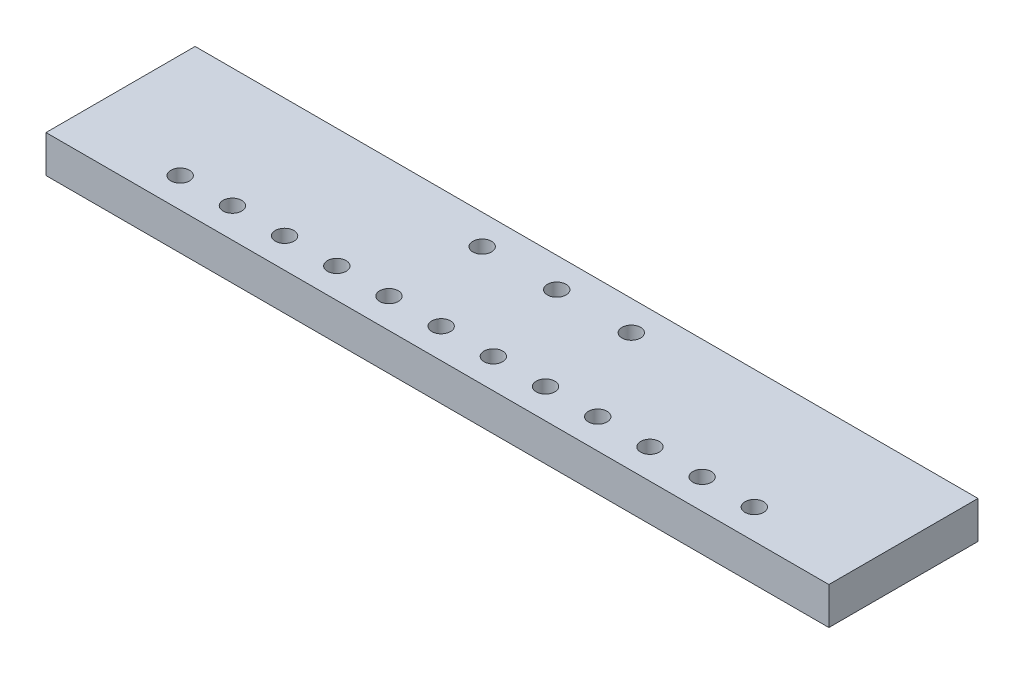
ISO-10303-21;
HEADER;
FILE_DESCRIPTION(('STEP AP214'),'2;1');
FILE_NAME('part.step','',(''),(''),'','','');
FILE_SCHEMA(('AUTOMOTIVE_DESIGN { 1 0 10303 214 1 1 1 1 }'));
ENDSEC;
DATA;
#1=APPLICATION_CONTEXT('core data for automotive mechanical design processes');
#2=APPLICATION_PROTOCOL_DEFINITION('international standard','automotive_design',2000,#1);
#3=PRODUCT_CONTEXT('',#1,'mechanical');
#4=PRODUCT('Part','Part','',(#3));
#5=PRODUCT_RELATED_PRODUCT_CATEGORY('part','',(#4));
#6=PRODUCT_DEFINITION_FORMATION('','',#4);
#7=PRODUCT_DEFINITION_CONTEXT('part definition',#1,'design');
#8=PRODUCT_DEFINITION('design','',#6,#7);
#9=PRODUCT_DEFINITION_SHAPE('','',#8);
#10=(LENGTH_UNIT() NAMED_UNIT(*) SI_UNIT(.MILLI.,.METRE.));
#11=(NAMED_UNIT(*) PLANE_ANGLE_UNIT() SI_UNIT($,.RADIAN.));
#12=(NAMED_UNIT(*) SI_UNIT($,.STERADIAN.) SOLID_ANGLE_UNIT());
#13=UNCERTAINTY_MEASURE_WITH_UNIT(LENGTH_MEASURE(1.E-05),#10,'distance_accuracy_value','');
#14=(GEOMETRIC_REPRESENTATION_CONTEXT(3) GLOBAL_UNCERTAINTY_ASSIGNED_CONTEXT((#13)) GLOBAL_UNIT_ASSIGNED_CONTEXT((#10,
#11,#12)) REPRESENTATION_CONTEXT('',''));
#15=CARTESIAN_POINT('',(0.,0.,0.));
#16=DIRECTION('',(0.,0.,1.));
#17=DIRECTION('',(1.,0.,0.));
#18=AXIS2_PLACEMENT_3D('',#15,#16,#17);
#19=CARTESIAN_POINT('',(66.675,6.35,12.7));
#20=DIRECTION('',(-1.,0.,0.));
#21=DIRECTION('',(0.,0.,1.));
#22=AXIS2_PLACEMENT_3D('',#19,#20,#21);
#23=PLANE('',#22);
#24=DIRECTION('',(0.,0.,-1.));
#25=VECTOR('',#24,1.);
#26=CARTESIAN_POINT('',(66.675,0.,12.7));
#27=LINE('',#26,#25);
#28=CARTESIAN_POINT('',(66.675,0.,12.7));
#29=VERTEX_POINT('',#28);
#30=CARTESIAN_POINT('',(66.675,0.,-12.7));
#31=VERTEX_POINT('',#30);
#32=EDGE_CURVE('E97',#29,#31,#27,.T.);
#33=ORIENTED_EDGE('',*,*,#32,.T.);
#34=DIRECTION('',(0.,-1.,0.));
#35=VECTOR('',#34,1.);
#36=CARTESIAN_POINT('',(66.675,6.35,-12.7));
#37=LINE('',#36,#35);
#38=CARTESIAN_POINT('',(66.675,6.35,-12.7));
#39=VERTEX_POINT('',#38);
#40=EDGE_CURVE('E11',#39,#31,#37,.T.);
#41=ORIENTED_EDGE('',*,*,#40,.F.);
#42=DIRECTION('',(0.,0.,-1.));
#43=VECTOR('',#42,1.);
#44=CARTESIAN_POINT('',(66.675,6.35,12.7));
#45=LINE('',#44,#43);
#46=CARTESIAN_POINT('',(66.675,6.35,12.7));
#47=VERTEX_POINT('',#46);
#48=EDGE_CURVE('E85',#47,#39,#45,.T.);
#49=ORIENTED_EDGE('',*,*,#48,.F.);
#50=DIRECTION('',(0.,-1.,0.));
#51=VECTOR('',#50,1.);
#52=CARTESIAN_POINT('',(66.675,6.35,12.7));
#53=LINE('',#52,#51);
#54=EDGE_CURVE('E93',#47,#29,#53,.T.);
#55=ORIENTED_EDGE('',*,*,#54,.T.);
#56=EDGE_LOOP('',(#33,#41,#49,#55));
#57=FACE_BOUND('',#56,.T.);
#58=ADVANCED_FACE('F34',(#57),#23,.F.);
#59=CARTESIAN_POINT('',(-66.675,6.35,-12.7));
#60=DIRECTION('',(0.,0.,1.));
#61=DIRECTION('',(1.,0.,0.));
#62=AXIS2_PLACEMENT_3D('',#59,#60,#61);
#63=PLANE('',#62);
#64=DIRECTION('',(-1.,0.,0.));
#65=VECTOR('',#64,1.);
#66=CARTESIAN_POINT('',(-66.675,0.,-12.7));
#67=LINE('',#66,#65);
#68=CARTESIAN_POINT('',(-66.675,0.,-12.7));
#69=VERTEX_POINT('',#68);
#70=EDGE_CURVE('E89',#31,#69,#67,.T.);
#71=ORIENTED_EDGE('',*,*,#70,.T.);
#72=DIRECTION('',(0.,-1.,0.));
#73=VECTOR('',#72,1.);
#74=CARTESIAN_POINT('',(-66.675,6.35,-12.7));
#75=LINE('',#74,#73);
#76=CARTESIAN_POINT('',(-66.675,6.35,-12.7));
#77=VERTEX_POINT('',#76);
#78=EDGE_CURVE('E42',#77,#69,#75,.T.);
#79=ORIENTED_EDGE('',*,*,#78,.F.);
#80=DIRECTION('',(-1.,0.,0.));
#81=VECTOR('',#80,1.);
#82=CARTESIAN_POINT('',(-66.675,6.35,-12.7));
#83=LINE('',#82,#81);
#84=EDGE_CURVE('E80',#39,#77,#83,.T.);
#85=ORIENTED_EDGE('',*,*,#84,.F.);
#86=ORIENTED_EDGE('',*,*,#40,.T.);
#87=EDGE_LOOP('',(#71,#79,#85,#86));
#88=FACE_BOUND('',#87,.T.);
#89=ADVANCED_FACE('F88',(#88),#63,.F.);
#90=CARTESIAN_POINT('',(-66.675,6.35,12.7));
#91=DIRECTION('',(1.,0.,0.));
#92=DIRECTION('',(0.,0.,-1.));
#93=AXIS2_PLACEMENT_3D('',#90,#91,#92);
#94=PLANE('',#93);
#95=DIRECTION('',(0.,0.,1.));
#96=VECTOR('',#95,1.);
#97=CARTESIAN_POINT('',(-66.675,0.,12.7));
#98=LINE('',#97,#96);
#99=CARTESIAN_POINT('',(-66.675,0.,12.7));
#100=VERTEX_POINT('',#99);
#101=EDGE_CURVE('E67',#69,#100,#98,.T.);
#102=ORIENTED_EDGE('',*,*,#101,.T.);
#103=DIRECTION('',(0.,-1.,0.));
#104=VECTOR('',#103,1.);
#105=CARTESIAN_POINT('',(-66.675,6.35,12.7));
#106=LINE('',#105,#104);
#107=CARTESIAN_POINT('',(-66.675,6.35,12.7));
#108=VERTEX_POINT('',#107);
#109=EDGE_CURVE('E90',#108,#100,#106,.T.);
#110=ORIENTED_EDGE('',*,*,#109,.F.);
#111=DIRECTION('',(0.,0.,1.));
#112=VECTOR('',#111,1.);
#113=CARTESIAN_POINT('',(-66.675,6.35,12.7));
#114=LINE('',#113,#112);
#115=EDGE_CURVE('E83',#77,#108,#114,.T.);
#116=ORIENTED_EDGE('',*,*,#115,.F.);
#117=ORIENTED_EDGE('',*,*,#78,.T.);
#118=EDGE_LOOP('',(#102,#110,#116,#117));
#119=FACE_BOUND('',#118,.T.);
#120=ADVANCED_FACE('F91',(#119),#94,.F.);
#121=CARTESIAN_POINT('',(-66.675,6.35,12.7));
#122=DIRECTION('',(0.,0.,-1.));
#123=DIRECTION('',(-1.,0.,0.));
#124=AXIS2_PLACEMENT_3D('',#121,#122,#123);
#125=PLANE('',#124);
#126=DIRECTION('',(1.,0.,0.));
#127=VECTOR('',#126,1.);
#128=CARTESIAN_POINT('',(-66.675,0.,12.7));
#129=LINE('',#128,#127);
#130=EDGE_CURVE('E73',#100,#29,#129,.T.);
#131=ORIENTED_EDGE('',*,*,#130,.T.);
#132=ORIENTED_EDGE('',*,*,#54,.F.);
#133=DIRECTION('',(1.,0.,0.));
#134=VECTOR('',#133,1.);
#135=CARTESIAN_POINT('',(-66.675,6.35,12.7));
#136=LINE('',#135,#134);
#137=EDGE_CURVE('E50',#108,#47,#136,.T.);
#138=ORIENTED_EDGE('',*,*,#137,.F.);
#139=ORIENTED_EDGE('',*,*,#109,.T.);
#140=EDGE_LOOP('',(#131,#132,#138,#139));
#141=FACE_BOUND('',#140,.T.);
#142=ADVANCED_FACE('F105',(#141),#125,.F.);
#143=CARTESIAN_POINT('',(0.,6.35,0.));
#144=DIRECTION('',(0.,-1.,0.));
#145=DIRECTION('',(0.,0.,-1.));
#146=AXIS2_PLACEMENT_3D('',#143,#144,#145);
#147=PLANE('',#146);
#148=CARTESIAN_POINT('',(48.895,6.35,7.62));
#149=DIRECTION('',(0.,1.,0.));
#150=DIRECTION('',(0.,0.,1.));
#151=AXIS2_PLACEMENT_3D('',#148,#149,#150);
#152=CIRCLE('',#151,1.5875);
#153=CARTESIAN_POINT('',(48.895,6.35,9.2075));
#154=VERTEX_POINT('',#153);
#155=EDGE_CURVE('E163',#154,#154,#152,.T.);
#156=ORIENTED_EDGE('',*,*,#155,.F.);
#157=EDGE_LOOP('',(#156));
#158=FACE_BOUND('',#157,.T.);
#159=CARTESIAN_POINT('',(40.005,6.35,7.62));
#160=DIRECTION('',(0.,1.,0.));
#161=DIRECTION('',(0.,0.,1.));
#162=AXIS2_PLACEMENT_3D('',#159,#160,#161);
#163=CIRCLE('',#162,1.5875);
#164=CARTESIAN_POINT('',(40.005,6.35,9.2075));
#165=VERTEX_POINT('',#164);
#166=EDGE_CURVE('E162',#165,#165,#163,.T.);
#167=ORIENTED_EDGE('',*,*,#166,.F.);
#168=EDGE_LOOP('',(#167));
#169=FACE_BOUND('',#168,.T.);
#170=CARTESIAN_POINT('',(31.115,6.35,7.62));
#171=DIRECTION('',(0.,1.,0.));
#172=DIRECTION('',(0.,0.,1.));
#173=AXIS2_PLACEMENT_3D('',#170,#171,#172);
#174=CIRCLE('',#173,1.5875);
#175=CARTESIAN_POINT('',(31.115,6.35,9.2075));
#176=VERTEX_POINT('',#175);
#177=EDGE_CURVE('E169',#176,#176,#174,.T.);
#178=ORIENTED_EDGE('',*,*,#177,.F.);
#179=EDGE_LOOP('',(#178));
#180=FACE_BOUND('',#179,.T.);
#181=CARTESIAN_POINT('',(22.225,6.35,7.62));
#182=DIRECTION('',(0.,1.,0.));
#183=DIRECTION('',(0.,0.,1.));
#184=AXIS2_PLACEMENT_3D('',#181,#182,#183);
#185=CIRCLE('',#184,1.5875);
#186=CARTESIAN_POINT('',(22.225,6.35,9.2075));
#187=VERTEX_POINT('',#186);
#188=EDGE_CURVE('E175',#187,#187,#185,.T.);
#189=ORIENTED_EDGE('',*,*,#188,.F.);
#190=EDGE_LOOP('',(#189));
#191=FACE_BOUND('',#190,.T.);
#192=CARTESIAN_POINT('',(13.335,6.35,7.62));
#193=DIRECTION('',(0.,1.,0.));
#194=DIRECTION('',(0.,0.,1.));
#195=AXIS2_PLACEMENT_3D('',#192,#193,#194);
#196=CIRCLE('',#195,1.5875);
#197=CARTESIAN_POINT('',(13.335,6.35,9.2075));
#198=VERTEX_POINT('',#197);
#199=EDGE_CURVE('E181',#198,#198,#196,.T.);
#200=ORIENTED_EDGE('',*,*,#199,.F.);
#201=EDGE_LOOP('',(#200));
#202=FACE_BOUND('',#201,.T.);
#203=CARTESIAN_POINT('',(4.445,6.35,7.62));
#204=DIRECTION('',(0.,1.,0.));
#205=DIRECTION('',(0.,0.,1.));
#206=AXIS2_PLACEMENT_3D('',#203,#204,#205);
#207=CIRCLE('',#206,1.5875);
#208=CARTESIAN_POINT('',(4.445,6.35,9.2075));
#209=VERTEX_POINT('',#208);
#210=EDGE_CURVE('E187',#209,#209,#207,.T.);
#211=ORIENTED_EDGE('',*,*,#210,.F.);
#212=EDGE_LOOP('',(#211));
#213=FACE_BOUND('',#212,.T.);
#214=CARTESIAN_POINT('',(-4.445,6.35,7.62));
#215=DIRECTION('',(0.,1.,0.));
#216=DIRECTION('',(0.,0.,1.));
#217=AXIS2_PLACEMENT_3D('',#214,#215,#216);
#218=CIRCLE('',#217,1.5875);
#219=CARTESIAN_POINT('',(-4.445,6.35,9.2075));
#220=VERTEX_POINT('',#219);
#221=EDGE_CURVE('E193',#220,#220,#218,.T.);
#222=ORIENTED_EDGE('',*,*,#221,.F.);
#223=EDGE_LOOP('',(#222));
#224=FACE_BOUND('',#223,.T.);
#225=CARTESIAN_POINT('',(-40.005,6.35,7.62));
#226=DIRECTION('',(0.,1.,0.));
#227=DIRECTION('',(0.,0.,1.));
#228=AXIS2_PLACEMENT_3D('',#225,#226,#227);
#229=CIRCLE('',#228,1.5875);
#230=CARTESIAN_POINT('',(-40.005,6.35,9.2075));
#231=VERTEX_POINT('',#230);
#232=EDGE_CURVE('E127',#231,#231,#229,.T.);
#233=ORIENTED_EDGE('',*,*,#232,.F.);
#234=EDGE_LOOP('',(#233));
#235=FACE_BOUND('',#234,.T.);
#236=CARTESIAN_POINT('',(12.7,6.35,-7.62));
#237=DIRECTION('',(0.,1.,0.));
#238=DIRECTION('',(0.,0.,1.));
#239=AXIS2_PLACEMENT_3D('',#236,#237,#238);
#240=CIRCLE('',#239,1.5875);
#241=CARTESIAN_POINT('',(12.7,6.35,-6.0325));
#242=VERTEX_POINT('',#241);
#243=EDGE_CURVE('E126',#242,#242,#240,.T.);
#244=ORIENTED_EDGE('',*,*,#243,.F.);
#245=EDGE_LOOP('',(#244));
#246=FACE_BOUND('',#245,.T.);
#247=CARTESIAN_POINT('',(-12.7,6.35,-7.62));
#248=DIRECTION('',(0.,1.,0.));
#249=DIRECTION('',(0.,0.,1.));
#250=AXIS2_PLACEMENT_3D('',#247,#248,#249);
#251=CIRCLE('',#250,1.5875);
#252=CARTESIAN_POINT('',(-12.7,6.35,-6.0325));
#253=VERTEX_POINT('',#252);
#254=EDGE_CURVE('E119',#253,#253,#251,.T.);
#255=ORIENTED_EDGE('',*,*,#254,.F.);
#256=EDGE_LOOP('',(#255));
#257=FACE_BOUND('',#256,.T.);
#258=CARTESIAN_POINT('',(-22.225,6.35,7.62));
#259=DIRECTION('',(0.,1.,0.));
#260=DIRECTION('',(0.,0.,1.));
#261=AXIS2_PLACEMENT_3D('',#258,#259,#260);
#262=CIRCLE('',#261,1.5875);
#263=CARTESIAN_POINT('',(-22.225,6.35,9.2075));
#264=VERTEX_POINT('',#263);
#265=EDGE_CURVE('E151',#264,#264,#262,.T.);
#266=ORIENTED_EDGE('',*,*,#265,.F.);
#267=EDGE_LOOP('',(#266));
#268=FACE_BOUND('',#267,.T.);
#269=CARTESIAN_POINT('',(-48.895,6.35,7.62));
#270=DIRECTION('',(0.,1.,0.));
#271=DIRECTION('',(0.,0.,1.));
#272=AXIS2_PLACEMENT_3D('',#269,#270,#271);
#273=CIRCLE('',#272,1.5875);
#274=CARTESIAN_POINT('',(-48.895,6.35,9.2075));
#275=VERTEX_POINT('',#274);
#276=EDGE_CURVE('E150',#275,#275,#273,.T.);
#277=ORIENTED_EDGE('',*,*,#276,.F.);
#278=EDGE_LOOP('',(#277));
#279=FACE_BOUND('',#278,.T.);
#280=CARTESIAN_POINT('',(-13.335,6.35,7.62));
#281=DIRECTION('',(0.,1.,0.));
#282=DIRECTION('',(0.,0.,1.));
#283=AXIS2_PLACEMENT_3D('',#280,#281,#282);
#284=CIRCLE('',#283,1.5875);
#285=CARTESIAN_POINT('',(-13.335,6.35,9.2075));
#286=VERTEX_POINT('',#285);
#287=EDGE_CURVE('E139',#286,#286,#284,.T.);
#288=ORIENTED_EDGE('',*,*,#287,.F.);
#289=EDGE_LOOP('',(#288));
#290=FACE_BOUND('',#289,.T.);
#291=CARTESIAN_POINT('',(-31.115,6.35,7.62));
#292=DIRECTION('',(0.,1.,0.));
#293=DIRECTION('',(0.,0.,1.));
#294=AXIS2_PLACEMENT_3D('',#291,#292,#293);
#295=CIRCLE('',#294,1.5875);
#296=CARTESIAN_POINT('',(-31.115,6.35,9.2075));
#297=VERTEX_POINT('',#296);
#298=EDGE_CURVE('E138',#297,#297,#295,.T.);
#299=ORIENTED_EDGE('',*,*,#298,.F.);
#300=EDGE_LOOP('',(#299));
#301=FACE_BOUND('',#300,.T.);
#302=CARTESIAN_POINT('',(0.,6.35,-7.62));
#303=DIRECTION('',(0.,1.,0.));
#304=DIRECTION('',(0.,0.,1.));
#305=AXIS2_PLACEMENT_3D('',#302,#303,#304);
#306=CIRCLE('',#305,1.5875);
#307=CARTESIAN_POINT('',(0.,6.35,-6.0325));
#308=VERTEX_POINT('',#307);
#309=EDGE_CURVE('E113',#308,#308,#306,.T.);
#310=ORIENTED_EDGE('',*,*,#309,.F.);
#311=EDGE_LOOP('',(#310));
#312=FACE_BOUND('',#311,.T.);
#313=ORIENTED_EDGE('',*,*,#48,.T.);
#314=ORIENTED_EDGE('',*,*,#84,.T.);
#315=ORIENTED_EDGE('',*,*,#115,.T.);
#316=ORIENTED_EDGE('',*,*,#137,.T.);
#317=EDGE_LOOP('',(#313,#314,#315,#316));
#318=FACE_BOUND('',#317,.T.);
#319=ADVANCED_FACE('F81',(#158,#169,#180,#191,#202,#213,#224,#235,#246,#257,#268,#279,#290,#301,
#312,#318),#147,.F.);
#320=CARTESIAN_POINT('',(0.,0.,0.));
#321=DIRECTION('',(0.,-1.,0.));
#322=DIRECTION('',(0.,0.,-1.));
#323=AXIS2_PLACEMENT_3D('',#320,#321,#322);
#324=PLANE('',#323);
#325=CARTESIAN_POINT('',(48.895,0.,7.62));
#326=DIRECTION('',(0.,-1.,0.));
#327=DIRECTION('',(0.,0.,-1.));
#328=AXIS2_PLACEMENT_3D('',#325,#326,#327);
#329=CIRCLE('',#328,1.5875);
#330=CARTESIAN_POINT('',(48.895,0.,6.0325));
#331=VERTEX_POINT('',#330);
#332=EDGE_CURVE('E159',#331,#331,#329,.F.);
#333=ORIENTED_EDGE('',*,*,#332,.T.);
#334=EDGE_LOOP('',(#333));
#335=FACE_BOUND('',#334,.T.);
#336=CARTESIAN_POINT('',(40.005,0.,7.62));
#337=DIRECTION('',(0.,-1.,0.));
#338=DIRECTION('',(0.,0.,-1.));
#339=AXIS2_PLACEMENT_3D('',#336,#337,#338);
#340=CIRCLE('',#339,1.5875);
#341=CARTESIAN_POINT('',(40.005,0.,6.0325));
#342=VERTEX_POINT('',#341);
#343=EDGE_CURVE('E166',#342,#342,#340,.F.);
#344=ORIENTED_EDGE('',*,*,#343,.T.);
#345=EDGE_LOOP('',(#344));
#346=FACE_BOUND('',#345,.T.);
#347=CARTESIAN_POINT('',(31.115,0.,7.62));
#348=DIRECTION('',(0.,-1.,0.));
#349=DIRECTION('',(0.,0.,-1.));
#350=AXIS2_PLACEMENT_3D('',#347,#348,#349);
#351=CIRCLE('',#350,1.5875);
#352=CARTESIAN_POINT('',(31.115,0.,6.0325));
#353=VERTEX_POINT('',#352);
#354=EDGE_CURVE('E172',#353,#353,#351,.F.);
#355=ORIENTED_EDGE('',*,*,#354,.T.);
#356=EDGE_LOOP('',(#355));
#357=FACE_BOUND('',#356,.T.);
#358=CARTESIAN_POINT('',(22.225,0.,7.62));
#359=DIRECTION('',(0.,-1.,0.));
#360=DIRECTION('',(0.,0.,-1.));
#361=AXIS2_PLACEMENT_3D('',#358,#359,#360);
#362=CIRCLE('',#361,1.5875);
#363=CARTESIAN_POINT('',(22.225,0.,6.0325));
#364=VERTEX_POINT('',#363);
#365=EDGE_CURVE('E178',#364,#364,#362,.F.);
#366=ORIENTED_EDGE('',*,*,#365,.T.);
#367=EDGE_LOOP('',(#366));
#368=FACE_BOUND('',#367,.T.);
#369=CARTESIAN_POINT('',(13.335,0.,7.62));
#370=DIRECTION('',(0.,-1.,0.));
#371=DIRECTION('',(0.,0.,-1.));
#372=AXIS2_PLACEMENT_3D('',#369,#370,#371);
#373=CIRCLE('',#372,1.5875);
#374=CARTESIAN_POINT('',(13.335,0.,6.03249999999999));
#375=VERTEX_POINT('',#374);
#376=EDGE_CURVE('E184',#375,#375,#373,.F.);
#377=ORIENTED_EDGE('',*,*,#376,.T.);
#378=EDGE_LOOP('',(#377));
#379=FACE_BOUND('',#378,.T.);
#380=CARTESIAN_POINT('',(4.445,0.,7.62));
#381=DIRECTION('',(0.,-1.,0.));
#382=DIRECTION('',(0.,0.,-1.));
#383=AXIS2_PLACEMENT_3D('',#380,#381,#382);
#384=CIRCLE('',#383,1.5875);
#385=CARTESIAN_POINT('',(4.445,0.,6.0325));
#386=VERTEX_POINT('',#385);
#387=EDGE_CURVE('E190',#386,#386,#384,.F.);
#388=ORIENTED_EDGE('',*,*,#387,.T.);
#389=EDGE_LOOP('',(#388));
#390=FACE_BOUND('',#389,.T.);
#391=CARTESIAN_POINT('',(-4.445,0.,7.62));
#392=DIRECTION('',(0.,-1.,0.));
#393=DIRECTION('',(0.,0.,-1.));
#394=AXIS2_PLACEMENT_3D('',#391,#392,#393);
#395=CIRCLE('',#394,1.5875);
#396=CARTESIAN_POINT('',(-4.445,0.,6.0325));
#397=VERTEX_POINT('',#396);
#398=EDGE_CURVE('E154',#397,#397,#395,.F.);
#399=ORIENTED_EDGE('',*,*,#398,.T.);
#400=EDGE_LOOP('',(#399));
#401=FACE_BOUND('',#400,.T.);
#402=CARTESIAN_POINT('',(-40.005,0.,7.62));
#403=DIRECTION('',(0.,-1.,0.));
#404=DIRECTION('',(0.,0.,-1.));
#405=AXIS2_PLACEMENT_3D('',#402,#403,#404);
#406=CIRCLE('',#405,1.5875);
#407=CARTESIAN_POINT('',(-40.005,0.,6.0325));
#408=VERTEX_POINT('',#407);
#409=EDGE_CURVE('E123',#408,#408,#406,.F.);
#410=ORIENTED_EDGE('',*,*,#409,.T.);
#411=EDGE_LOOP('',(#410));
#412=FACE_BOUND('',#411,.T.);
#413=CARTESIAN_POINT('',(12.7,0.,-7.62));
#414=DIRECTION('',(0.,-1.,0.));
#415=DIRECTION('',(0.,0.,-1.));
#416=AXIS2_PLACEMENT_3D('',#413,#414,#415);
#417=CIRCLE('',#416,1.5875);
#418=CARTESIAN_POINT('',(12.7,0.,-9.2075));
#419=VERTEX_POINT('',#418);
#420=EDGE_CURVE('E122',#419,#419,#417,.F.);
#421=ORIENTED_EDGE('',*,*,#420,.T.);
#422=EDGE_LOOP('',(#421));
#423=FACE_BOUND('',#422,.T.);
#424=CARTESIAN_POINT('',(-12.7,0.,-7.62));
#425=DIRECTION('',(0.,-1.,0.));
#426=DIRECTION('',(0.,0.,-1.));
#427=AXIS2_PLACEMENT_3D('',#424,#425,#426);
#428=CIRCLE('',#427,1.5875);
#429=CARTESIAN_POINT('',(-12.7,0.,-9.2075));
#430=VERTEX_POINT('',#429);
#431=EDGE_CURVE('E116',#430,#430,#428,.F.);
#432=ORIENTED_EDGE('',*,*,#431,.T.);
#433=EDGE_LOOP('',(#432));
#434=FACE_BOUND('',#433,.T.);
#435=CARTESIAN_POINT('',(-22.225,0.,7.62));
#436=DIRECTION('',(0.,-1.,0.));
#437=DIRECTION('',(0.,0.,-1.));
#438=AXIS2_PLACEMENT_3D('',#435,#436,#437);
#439=CIRCLE('',#438,1.5875);
#440=CARTESIAN_POINT('',(-22.225,0.,6.0325));
#441=VERTEX_POINT('',#440);
#442=EDGE_CURVE('E147',#441,#441,#439,.F.);
#443=ORIENTED_EDGE('',*,*,#442,.T.);
#444=EDGE_LOOP('',(#443));
#445=FACE_BOUND('',#444,.T.);
#446=CARTESIAN_POINT('',(-48.895,0.,7.62));
#447=DIRECTION('',(0.,-1.,0.));
#448=DIRECTION('',(0.,0.,-1.));
#449=AXIS2_PLACEMENT_3D('',#446,#447,#448);
#450=CIRCLE('',#449,1.5875);
#451=CARTESIAN_POINT('',(-48.895,0.,6.0325));
#452=VERTEX_POINT('',#451);
#453=EDGE_CURVE('E142',#452,#452,#450,.F.);
#454=ORIENTED_EDGE('',*,*,#453,.T.);
#455=EDGE_LOOP('',(#454));
#456=FACE_BOUND('',#455,.T.);
#457=CARTESIAN_POINT('',(-13.335,0.,7.62));
#458=DIRECTION('',(0.,-1.,0.));
#459=DIRECTION('',(0.,0.,-1.));
#460=AXIS2_PLACEMENT_3D('',#457,#458,#459);
#461=CIRCLE('',#460,1.5875);
#462=CARTESIAN_POINT('',(-13.335,0.,6.0325));
#463=VERTEX_POINT('',#462);
#464=EDGE_CURVE('E135',#463,#463,#461,.F.);
#465=ORIENTED_EDGE('',*,*,#464,.T.);
#466=EDGE_LOOP('',(#465));
#467=FACE_BOUND('',#466,.T.);
#468=CARTESIAN_POINT('',(-31.115,0.,7.62));
#469=DIRECTION('',(0.,-1.,0.));
#470=DIRECTION('',(0.,0.,-1.));
#471=AXIS2_PLACEMENT_3D('',#468,#469,#470);
#472=CIRCLE('',#471,1.5875);
#473=CARTESIAN_POINT('',(-31.115,0.,6.0325));
#474=VERTEX_POINT('',#473);
#475=EDGE_CURVE('E130',#474,#474,#472,.F.);
#476=ORIENTED_EDGE('',*,*,#475,.T.);
#477=EDGE_LOOP('',(#476));
#478=FACE_BOUND('',#477,.T.);
#479=CARTESIAN_POINT('',(0.,0.,-7.62));
#480=DIRECTION('',(0.,-1.,0.));
#481=DIRECTION('',(0.,0.,-1.));
#482=AXIS2_PLACEMENT_3D('',#479,#480,#481);
#483=CIRCLE('',#482,1.5875);
#484=CARTESIAN_POINT('',(0.,0.,-9.2075));
#485=VERTEX_POINT('',#484);
#486=EDGE_CURVE('E100',#485,#485,#483,.F.);
#487=ORIENTED_EDGE('',*,*,#486,.T.);
#488=EDGE_LOOP('',(#487));
#489=FACE_BOUND('',#488,.T.);
#490=ORIENTED_EDGE('',*,*,#32,.F.);
#491=ORIENTED_EDGE('',*,*,#130,.F.);
#492=ORIENTED_EDGE('',*,*,#101,.F.);
#493=ORIENTED_EDGE('',*,*,#70,.F.);
#494=EDGE_LOOP('',(#490,#491,#492,#493));
#495=FACE_BOUND('',#494,.T.);
#496=ADVANCED_FACE('F108',(#335,#346,#357,#368,#379,#390,#401,#412,#423,#434,#445,#456,#467,
#478,#489,#495),#324,.T.);
#497=CARTESIAN_POINT('',(0.,-4.49012806053459,-7.62));
#498=DIRECTION('',(0.,1.,0.));
#499=DIRECTION('',(0.,0.,1.));
#500=AXIS2_PLACEMENT_3D('',#497,#498,#499);
#501=CYLINDRICAL_SURFACE('',#500,1.5875);
#502=ORIENTED_EDGE('',*,*,#309,.T.);
#503=EDGE_LOOP('',(#502));
#504=FACE_BOUND('',#503,.T.);
#505=ORIENTED_EDGE('',*,*,#486,.F.);
#506=EDGE_LOOP('',(#505));
#507=FACE_BOUND('',#506,.T.);
#508=ADVANCED_FACE('F224',(#504,#507),#501,.F.);
#509=CARTESIAN_POINT('',(-31.115,-4.49012806053459,7.62));
#510=DIRECTION('',(0.,1.,0.));
#511=DIRECTION('',(0.,0.,1.));
#512=AXIS2_PLACEMENT_3D('',#509,#510,#511);
#513=CYLINDRICAL_SURFACE('',#512,1.5875);
#514=ORIENTED_EDGE('',*,*,#298,.T.);
#515=EDGE_LOOP('',(#514));
#516=FACE_BOUND('',#515,.T.);
#517=ORIENTED_EDGE('',*,*,#475,.F.);
#518=EDGE_LOOP('',(#517));
#519=FACE_BOUND('',#518,.T.);
#520=ADVANCED_FACE('F227',(#516,#519),#513,.F.);
#521=CARTESIAN_POINT('',(-13.335,-4.49012806053459,7.62));
#522=DIRECTION('',(0.,1.,0.));
#523=DIRECTION('',(0.,0.,1.));
#524=AXIS2_PLACEMENT_3D('',#521,#522,#523);
#525=CYLINDRICAL_SURFACE('',#524,1.5875);
#526=ORIENTED_EDGE('',*,*,#287,.T.);
#527=EDGE_LOOP('',(#526));
#528=FACE_BOUND('',#527,.T.);
#529=ORIENTED_EDGE('',*,*,#464,.F.);
#530=EDGE_LOOP('',(#529));
#531=FACE_BOUND('',#530,.T.);
#532=ADVANCED_FACE('F271',(#528,#531),#525,.F.);
#533=CARTESIAN_POINT('',(-48.895,-4.49012806053459,7.62));
#534=DIRECTION('',(0.,1.,0.));
#535=DIRECTION('',(0.,0.,1.));
#536=AXIS2_PLACEMENT_3D('',#533,#534,#535);
#537=CYLINDRICAL_SURFACE('',#536,1.5875);
#538=ORIENTED_EDGE('',*,*,#276,.T.);
#539=EDGE_LOOP('',(#538));
#540=FACE_BOUND('',#539,.T.);
#541=ORIENTED_EDGE('',*,*,#453,.F.);
#542=EDGE_LOOP('',(#541));
#543=FACE_BOUND('',#542,.T.);
#544=ADVANCED_FACE('F279',(#540,#543),#537,.F.);
#545=CARTESIAN_POINT('',(-22.225,-4.49012806053459,7.62));
#546=DIRECTION('',(0.,1.,0.));
#547=DIRECTION('',(0.,0.,1.));
#548=AXIS2_PLACEMENT_3D('',#545,#546,#547);
#549=CYLINDRICAL_SURFACE('',#548,1.5875);
#550=ORIENTED_EDGE('',*,*,#265,.T.);
#551=EDGE_LOOP('',(#550));
#552=FACE_BOUND('',#551,.T.);
#553=ORIENTED_EDGE('',*,*,#442,.F.);
#554=EDGE_LOOP('',(#553));
#555=FACE_BOUND('',#554,.T.);
#556=ADVANCED_FACE('F287',(#552,#555),#549,.F.);
#557=CARTESIAN_POINT('',(-12.7,-4.49012806053459,-7.62));
#558=DIRECTION('',(0.,1.,0.));
#559=DIRECTION('',(0.,0.,1.));
#560=AXIS2_PLACEMENT_3D('',#557,#558,#559);
#561=CYLINDRICAL_SURFACE('',#560,1.5875);
#562=ORIENTED_EDGE('',*,*,#254,.T.);
#563=EDGE_LOOP('',(#562));
#564=FACE_BOUND('',#563,.T.);
#565=ORIENTED_EDGE('',*,*,#431,.F.);
#566=EDGE_LOOP('',(#565));
#567=FACE_BOUND('',#566,.T.);
#568=ADVANCED_FACE('F295',(#564,#567),#561,.F.);
#569=CARTESIAN_POINT('',(12.7,-4.49012806053459,-7.62));
#570=DIRECTION('',(0.,1.,0.));
#571=DIRECTION('',(0.,0.,1.));
#572=AXIS2_PLACEMENT_3D('',#569,#570,#571);
#573=CYLINDRICAL_SURFACE('',#572,1.5875);
#574=ORIENTED_EDGE('',*,*,#243,.T.);
#575=EDGE_LOOP('',(#574));
#576=FACE_BOUND('',#575,.T.);
#577=ORIENTED_EDGE('',*,*,#420,.F.);
#578=EDGE_LOOP('',(#577));
#579=FACE_BOUND('',#578,.T.);
#580=ADVANCED_FACE('F303',(#576,#579),#573,.F.);
#581=CARTESIAN_POINT('',(-40.005,-4.49012806053459,7.62));
#582=DIRECTION('',(0.,1.,0.));
#583=DIRECTION('',(0.,0.,1.));
#584=AXIS2_PLACEMENT_3D('',#581,#582,#583);
#585=CYLINDRICAL_SURFACE('',#584,1.5875);
#586=ORIENTED_EDGE('',*,*,#232,.T.);
#587=EDGE_LOOP('',(#586));
#588=FACE_BOUND('',#587,.T.);
#589=ORIENTED_EDGE('',*,*,#409,.F.);
#590=EDGE_LOOP('',(#589));
#591=FACE_BOUND('',#590,.T.);
#592=ADVANCED_FACE('F311',(#588,#591),#585,.F.);
#593=CARTESIAN_POINT('',(-4.445,-4.49012806053459,7.62));
#594=DIRECTION('',(0.,1.,0.));
#595=DIRECTION('',(0.,0.,1.));
#596=AXIS2_PLACEMENT_3D('',#593,#594,#595);
#597=CYLINDRICAL_SURFACE('',#596,1.5875);
#598=ORIENTED_EDGE('',*,*,#221,.T.);
#599=EDGE_LOOP('',(#598));
#600=FACE_BOUND('',#599,.T.);
#601=ORIENTED_EDGE('',*,*,#398,.F.);
#602=EDGE_LOOP('',(#601));
#603=FACE_BOUND('',#602,.T.);
#604=ADVANCED_FACE('F201',(#600,#603),#597,.F.);
#605=CARTESIAN_POINT('',(4.445,-4.49012806053459,7.62));
#606=DIRECTION('',(0.,1.,0.));
#607=DIRECTION('',(0.,0.,1.));
#608=AXIS2_PLACEMENT_3D('',#605,#606,#607);
#609=CYLINDRICAL_SURFACE('',#608,1.5875);
#610=ORIENTED_EDGE('',*,*,#210,.T.);
#611=EDGE_LOOP('',(#610));
#612=FACE_BOUND('',#611,.T.);
#613=ORIENTED_EDGE('',*,*,#387,.F.);
#614=EDGE_LOOP('',(#613));
#615=FACE_BOUND('',#614,.T.);
#616=ADVANCED_FACE('F326',(#612,#615),#609,.F.);
#617=CARTESIAN_POINT('',(13.335,-4.49012806053459,7.62));
#618=DIRECTION('',(0.,1.,0.));
#619=DIRECTION('',(0.,0.,1.));
#620=AXIS2_PLACEMENT_3D('',#617,#618,#619);
#621=CYLINDRICAL_SURFACE('',#620,1.5875);
#622=ORIENTED_EDGE('',*,*,#199,.T.);
#623=EDGE_LOOP('',(#622));
#624=FACE_BOUND('',#623,.T.);
#625=ORIENTED_EDGE('',*,*,#376,.F.);
#626=EDGE_LOOP('',(#625));
#627=FACE_BOUND('',#626,.T.);
#628=ADVANCED_FACE('F333',(#624,#627),#621,.F.);
#629=CARTESIAN_POINT('',(22.225,-4.49012806053459,7.62));
#630=DIRECTION('',(0.,1.,0.));
#631=DIRECTION('',(0.,0.,1.));
#632=AXIS2_PLACEMENT_3D('',#629,#630,#631);
#633=CYLINDRICAL_SURFACE('',#632,1.5875);
#634=ORIENTED_EDGE('',*,*,#188,.T.);
#635=EDGE_LOOP('',(#634));
#636=FACE_BOUND('',#635,.T.);
#637=ORIENTED_EDGE('',*,*,#365,.F.);
#638=EDGE_LOOP('',(#637));
#639=FACE_BOUND('',#638,.T.);
#640=ADVANCED_FACE('F341',(#636,#639),#633,.F.);
#641=CARTESIAN_POINT('',(31.115,-4.49012806053459,7.62));
#642=DIRECTION('',(0.,1.,0.));
#643=DIRECTION('',(0.,0.,1.));
#644=AXIS2_PLACEMENT_3D('',#641,#642,#643);
#645=CYLINDRICAL_SURFACE('',#644,1.5875);
#646=ORIENTED_EDGE('',*,*,#177,.T.);
#647=EDGE_LOOP('',(#646));
#648=FACE_BOUND('',#647,.T.);
#649=ORIENTED_EDGE('',*,*,#354,.F.);
#650=EDGE_LOOP('',(#649));
#651=FACE_BOUND('',#650,.T.);
#652=ADVANCED_FACE('F349',(#648,#651),#645,.F.);
#653=CARTESIAN_POINT('',(40.005,-4.49012806053459,7.62));
#654=DIRECTION('',(0.,1.,0.));
#655=DIRECTION('',(0.,0.,1.));
#656=AXIS2_PLACEMENT_3D('',#653,#654,#655);
#657=CYLINDRICAL_SURFACE('',#656,1.5875);
#658=ORIENTED_EDGE('',*,*,#166,.T.);
#659=EDGE_LOOP('',(#658));
#660=FACE_BOUND('',#659,.T.);
#661=ORIENTED_EDGE('',*,*,#343,.F.);
#662=EDGE_LOOP('',(#661));
#663=FACE_BOUND('',#662,.T.);
#664=ADVANCED_FACE('F357',(#660,#663),#657,.F.);
#665=CARTESIAN_POINT('',(48.895,-4.49012806053459,7.62));
#666=DIRECTION('',(0.,1.,0.));
#667=DIRECTION('',(0.,0.,1.));
#668=AXIS2_PLACEMENT_3D('',#665,#666,#667);
#669=CYLINDRICAL_SURFACE('',#668,1.5875);
#670=ORIENTED_EDGE('',*,*,#155,.T.);
#671=EDGE_LOOP('',(#670));
#672=FACE_BOUND('',#671,.T.);
#673=ORIENTED_EDGE('',*,*,#332,.F.);
#674=EDGE_LOOP('',(#673));
#675=FACE_BOUND('',#674,.T.);
#676=ADVANCED_FACE('F365',(#672,#675),#669,.F.);
#677=CLOSED_SHELL('',(#58,#89,#120,#142,#319,#496,#508,#520,#532,#544,#556,#568,#580,#592,#604,
#616,#628,#640,#652,#664,#676));
#678=MANIFOLD_SOLID_BREP('B2',#677);
#679=ADVANCED_BREP_SHAPE_REPRESENTATION('',(#18,#678),#14);
#680=SHAPE_DEFINITION_REPRESENTATION(#9,#679);
ENDSEC;
END-ISO-10303-21;
